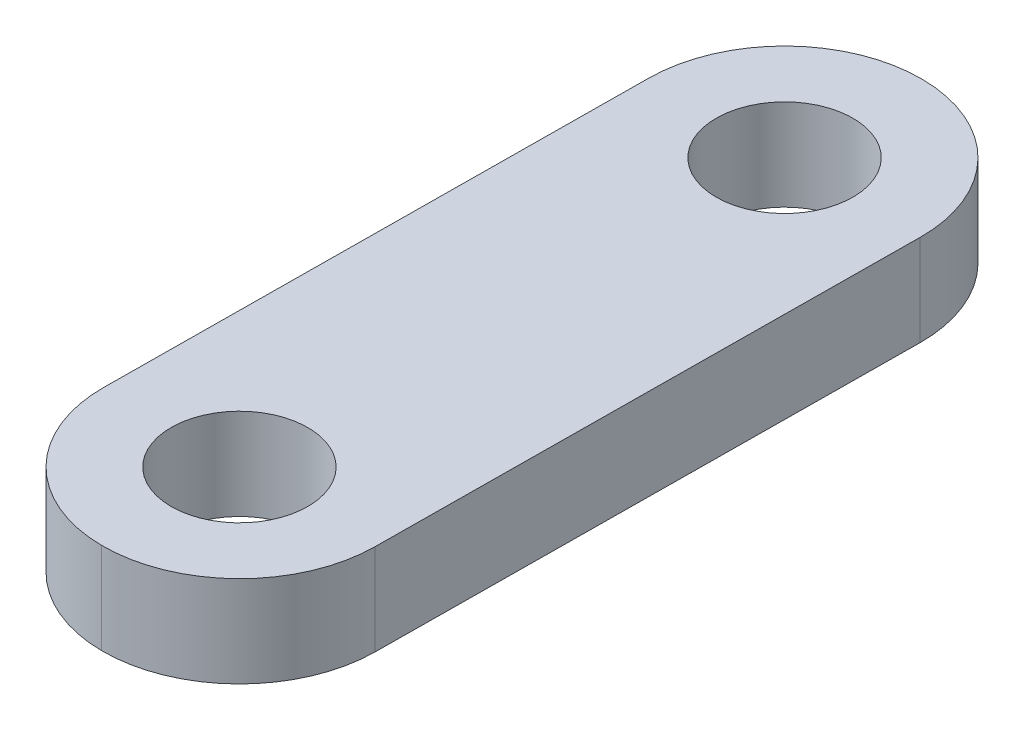
ISO-10303-21;
HEADER;
FILE_DESCRIPTION(('STEP AP214'),'2;1');
FILE_NAME('part.step','',(''),(''),'','','');
FILE_SCHEMA(('AUTOMOTIVE_DESIGN { 1 0 10303 214 1 1 1 1 }'));
ENDSEC;
DATA;
#1=APPLICATION_CONTEXT('core data for automotive mechanical design processes');
#2=APPLICATION_PROTOCOL_DEFINITION('international standard','automotive_design',2000,#1);
#3=PRODUCT_CONTEXT('',#1,'mechanical');
#4=PRODUCT('Part','Part','',(#3));
#5=PRODUCT_RELATED_PRODUCT_CATEGORY('part','',(#4));
#6=PRODUCT_DEFINITION_FORMATION('','',#4);
#7=PRODUCT_DEFINITION_CONTEXT('part definition',#1,'design');
#8=PRODUCT_DEFINITION('design','',#6,#7);
#9=PRODUCT_DEFINITION_SHAPE('','',#8);
#10=(LENGTH_UNIT() NAMED_UNIT(*) SI_UNIT(.MILLI.,.METRE.));
#11=(NAMED_UNIT(*) PLANE_ANGLE_UNIT() SI_UNIT($,.RADIAN.));
#12=(NAMED_UNIT(*) SI_UNIT($,.STERADIAN.) SOLID_ANGLE_UNIT());
#13=UNCERTAINTY_MEASURE_WITH_UNIT(LENGTH_MEASURE(1.E-05),#10,'distance_accuracy_value','');
#14=(GEOMETRIC_REPRESENTATION_CONTEXT(3) GLOBAL_UNCERTAINTY_ASSIGNED_CONTEXT((#13)) GLOBAL_UNIT_ASSIGNED_CONTEXT((#10,
#11,#12)) REPRESENTATION_CONTEXT('',''));
#15=CARTESIAN_POINT('',(0.,0.,0.));
#16=DIRECTION('',(0.,0.,1.));
#17=DIRECTION('',(1.,0.,0.));
#18=AXIS2_PLACEMENT_3D('',#15,#16,#17);
#19=CARTESIAN_POINT('',(0.,6.35,0.));
#20=DIRECTION('',(0.,-1.,0.));
#21=DIRECTION('',(0.,0.,-1.));
#22=AXIS2_PLACEMENT_3D('',#19,#20,#21);
#23=PLANE('',#22);
#24=DIRECTION('',(0.999962709223627,0.,0.00863598067069781));
#25=VECTOR('',#24,1.);
#26=CARTESIAN_POINT('',(149.563089122746,6.35,68.9373095472652));
#27=LINE('',#26,#25);
#28=CARTESIAN_POINT('',(159.087733928101,6.35,69.0195672631536));
#29=VERTEX_POINT('',#28);
#30=CARTESIAN_POINT('',(159.08844431739,6.35,69.0195733982905));
#31=VERTEX_POINT('',#30);
#32=EDGE_CURVE('E170',#29,#31,#27,.T.);
#33=ORIENTED_EDGE('',*,*,#32,.T.);
#34=CARTESIAN_POINT('',(159.170702033279,6.35,59.4949285929355));
#35=DIRECTION('',(0.,-1.,0.));
#36=DIRECTION('',(0.,0.,-1.));
#37=AXIS2_PLACEMENT_3D('',#34,#35,#36);
#38=CIRCLE('',#37,9.525);
#39=CARTESIAN_POINT('',(168.695346838634,6.35,59.5771863088239));
#40=VERTEX_POINT('',#39);
#41=EDGE_CURVE('E147',#31,#40,#38,.F.);
#42=ORIENTED_EDGE('',*,*,#41,.T.);
#43=DIRECTION('',(0.00863598067069853,0.,-0.999962709223627));
#44=VECTOR('',#43,1.);
#45=CARTESIAN_POINT('',(169.102624620199,6.35,12.4183737327467));
#46=LINE('',#45,#44);
#47=CARTESIAN_POINT('',(169.02036690431,6.35,21.9430185381017));
#48=VERTEX_POINT('',#47);
#49=EDGE_CURVE('E118',#40,#48,#46,.T.);
#50=ORIENTED_EDGE('',*,*,#49,.T.);
#51=CARTESIAN_POINT('',(159.495722098955,6.35,21.8607608222133));
#52=DIRECTION('',(0.,-1.,0.));
#53=DIRECTION('',(0.,0.,-1.));
#54=AXIS2_PLACEMENT_3D('',#51,#52,#53);
#55=CIRCLE('',#54,9.525);
#56=CARTESIAN_POINT('',(159.577979814844,6.35,12.3361160168583));
#57=VERTEX_POINT('',#56);
#58=EDGE_CURVE('E142',#48,#57,#55,.F.);
#59=ORIENTED_EDGE('',*,*,#58,.T.);
#60=DIRECTION('',(-0.999962709223627,0.,-0.00863598067069785));
#61=VECTOR('',#60,1.);
#62=CARTESIAN_POINT('',(150.052624620199,6.35,12.2538521658329));
#63=LINE('',#62,#61);
#64=CARTESIAN_POINT('',(159.577269425554,6.35,12.3361098817213));
#65=VERTEX_POINT('',#64);
#66=EDGE_CURVE('E125',#57,#65,#63,.T.);
#67=ORIENTED_EDGE('',*,*,#66,.T.);
#68=CARTESIAN_POINT('',(159.495011709665,6.35,21.8607546870764));
#69=DIRECTION('',(0.,-1.,0.));
#70=DIRECTION('',(0.,0.,-1.));
#71=AXIS2_PLACEMENT_3D('',#68,#69,#70);
#72=CIRCLE('',#71,9.525);
#73=CARTESIAN_POINT('',(149.97036690431,6.35,21.778496971188));
#74=VERTEX_POINT('',#73);
#75=EDGE_CURVE('E54',#65,#74,#72,.F.);
#76=ORIENTED_EDGE('',*,*,#75,.T.);
#77=DIRECTION('',(-0.00863598067069657,0.,0.999962709223627));
#78=VECTOR('',#77,1.);
#79=CARTESIAN_POINT('',(150.052624620199,6.35,12.2538521658329));
#80=LINE('',#79,#78);
#81=CARTESIAN_POINT('',(149.645346838634,6.35,59.4126647419101));
#82=VERTEX_POINT('',#81);
#83=EDGE_CURVE('E128',#74,#82,#80,.T.);
#84=ORIENTED_EDGE('',*,*,#83,.T.);
#85=CARTESIAN_POINT('',(159.169991643989,6.35,59.4949224577985));
#86=DIRECTION('',(0.,-1.,0.));
#87=DIRECTION('',(0.,0.,-1.));
#88=AXIS2_PLACEMENT_3D('',#85,#86,#87);
#89=CIRCLE('',#88,9.525);
#90=EDGE_CURVE('E145',#82,#29,#89,.F.);
#91=ORIENTED_EDGE('',*,*,#90,.T.);
#92=EDGE_LOOP('',(#33,#42,#50,#59,#67,#76,#84,#91));
#93=FACE_BOUND('',#92,.T.);
#94=CARTESIAN_POINT('',(159.49536690431,6.35,21.8607577546449));
#95=DIRECTION('',(0.,1.,0.));
#96=DIRECTION('',(0.,0.,1.));
#97=AXIS2_PLACEMENT_3D('',#94,#95,#96);
#98=CIRCLE('',#97,4.76250000000001);
#99=CARTESIAN_POINT('',(159.49536690431,6.35,26.6232577546449));
#100=VERTEX_POINT('',#99);
#101=EDGE_CURVE('E163',#100,#100,#98,.T.);
#102=ORIENTED_EDGE('',*,*,#101,.F.);
#103=EDGE_LOOP('',(#102));
#104=FACE_BOUND('',#103,.T.);
#105=CARTESIAN_POINT('',(159.170346838634,6.35,59.494925525367));
#106=DIRECTION('',(0.,1.,0.));
#107=DIRECTION('',(0.,0.,1.));
#108=AXIS2_PLACEMENT_3D('',#105,#106,#107);
#109=CIRCLE('',#108,4.76250000000001);
#110=CARTESIAN_POINT('',(159.170346838634,6.35,64.257425525367));
#111=VERTEX_POINT('',#110);
#112=EDGE_CURVE('E175',#111,#111,#109,.T.);
#113=ORIENTED_EDGE('',*,*,#112,.F.);
#114=EDGE_LOOP('',(#113));
#115=FACE_BOUND('',#114,.T.);
#116=ADVANCED_FACE('F32',(#93,#104,#115),#23,.F.);
#117=CARTESIAN_POINT('',(0.,0.,0.));
#118=DIRECTION('',(0.,-1.,0.));
#119=DIRECTION('',(0.,0.,-1.));
#120=AXIS2_PLACEMENT_3D('',#117,#118,#119);
#121=PLANE('',#120);
#122=CARTESIAN_POINT('',(159.49536690431,0.,21.8607577546449));
#123=DIRECTION('',(0.,1.,0.));
#124=DIRECTION('',(0.,0.,1.));
#125=AXIS2_PLACEMENT_3D('',#122,#123,#124);
#126=CIRCLE('',#125,4.76250000000001);
#127=CARTESIAN_POINT('',(159.49536690431,0.,26.6232577546449));
#128=VERTEX_POINT('',#127);
#129=EDGE_CURVE('E166',#128,#128,#126,.T.);
#130=ORIENTED_EDGE('',*,*,#129,.T.);
#131=EDGE_LOOP('',(#130));
#132=FACE_BOUND('',#131,.T.);
#133=DIRECTION('',(0.00863598067069853,0.,-0.999962709223627));
#134=VECTOR('',#133,1.);
#135=CARTESIAN_POINT('',(169.102624620199,0.,12.4183737327467));
#136=LINE('',#135,#134);
#137=CARTESIAN_POINT('',(168.695346838634,0.,59.5771863088239));
#138=VERTEX_POINT('',#137);
#139=CARTESIAN_POINT('',(169.02036690431,0.,21.9430185381017));
#140=VERTEX_POINT('',#139);
#141=EDGE_CURVE('E115',#138,#140,#136,.T.);
#142=ORIENTED_EDGE('',*,*,#141,.F.);
#143=CARTESIAN_POINT('',(159.170702033279,0.,59.4949285929355));
#144=DIRECTION('',(0.,-1.,0.));
#145=DIRECTION('',(0.,0.,-1.));
#146=AXIS2_PLACEMENT_3D('',#143,#144,#145);
#147=CIRCLE('',#146,9.525);
#148=CARTESIAN_POINT('',(159.08844431739,0.,69.0195733982905));
#149=VERTEX_POINT('',#148);
#150=EDGE_CURVE('E98',#138,#149,#147,.T.);
#151=ORIENTED_EDGE('',*,*,#150,.T.);
#152=DIRECTION('',(0.999962709223627,0.,0.00863598067069781));
#153=VECTOR('',#152,1.);
#154=CARTESIAN_POINT('',(149.563089122746,0.,68.9373095472652));
#155=LINE('',#154,#153);
#156=CARTESIAN_POINT('',(159.087733928101,0.,69.0195672631536));
#157=VERTEX_POINT('',#156);
#158=EDGE_CURVE('E126',#157,#149,#155,.T.);
#159=ORIENTED_EDGE('',*,*,#158,.F.);
#160=CARTESIAN_POINT('',(159.169991643989,0.,59.4949224577985));
#161=DIRECTION('',(0.,-1.,0.));
#162=DIRECTION('',(0.,0.,-1.));
#163=AXIS2_PLACEMENT_3D('',#160,#161,#162);
#164=CIRCLE('',#163,9.525);
#165=CARTESIAN_POINT('',(149.645346838634,0.,59.4126647419101));
#166=VERTEX_POINT('',#165);
#167=EDGE_CURVE('E109',#157,#166,#164,.T.);
#168=ORIENTED_EDGE('',*,*,#167,.T.);
#169=DIRECTION('',(-0.00863598067069657,0.,0.999962709223627));
#170=VECTOR('',#169,1.);
#171=CARTESIAN_POINT('',(150.052624620199,0.,12.2538521658329));
#172=LINE('',#171,#170);
#173=CARTESIAN_POINT('',(149.97036690431,0.,21.778496971188));
#174=VERTEX_POINT('',#173);
#175=EDGE_CURVE('E130',#174,#166,#172,.T.);
#176=ORIENTED_EDGE('',*,*,#175,.F.);
#177=CARTESIAN_POINT('',(159.495011709665,0.,21.8607546870764));
#178=DIRECTION('',(0.,-1.,0.));
#179=DIRECTION('',(0.,0.,-1.));
#180=AXIS2_PLACEMENT_3D('',#177,#178,#179);
#181=CIRCLE('',#180,9.525);
#182=CARTESIAN_POINT('',(159.577269425554,0.,12.3361098817213));
#183=VERTEX_POINT('',#182);
#184=EDGE_CURVE('E136',#174,#183,#181,.T.);
#185=ORIENTED_EDGE('',*,*,#184,.T.);
#186=DIRECTION('',(-0.999962709223627,0.,-0.00863598067069785));
#187=VECTOR('',#186,1.);
#188=CARTESIAN_POINT('',(150.052624620199,0.,12.2538521658329));
#189=LINE('',#188,#187);
#190=CARTESIAN_POINT('',(159.577979814844,0.,12.3361160168583));
#191=VERTEX_POINT('',#190);
#192=EDGE_CURVE('E158',#191,#183,#189,.T.);
#193=ORIENTED_EDGE('',*,*,#192,.F.);
#194=CARTESIAN_POINT('',(159.495722098955,0.,21.8607608222133));
#195=DIRECTION('',(0.,-1.,0.));
#196=DIRECTION('',(0.,0.,-1.));
#197=AXIS2_PLACEMENT_3D('',#194,#195,#196);
#198=CIRCLE('',#197,9.525);
#199=EDGE_CURVE('E119',#191,#140,#198,.T.);
#200=ORIENTED_EDGE('',*,*,#199,.T.);
#201=EDGE_LOOP('',(#142,#151,#159,#168,#176,#185,#193,#200));
#202=FACE_BOUND('',#201,.T.);
#203=CARTESIAN_POINT('',(159.170346838634,0.,59.494925525367));
#204=DIRECTION('',(0.,1.,0.));
#205=DIRECTION('',(0.,0.,1.));
#206=AXIS2_PLACEMENT_3D('',#203,#204,#205);
#207=CIRCLE('',#206,4.76250000000001);
#208=CARTESIAN_POINT('',(159.170346838634,0.,64.257425525367));
#209=VERTEX_POINT('',#208);
#210=EDGE_CURVE('E177',#209,#209,#207,.T.);
#211=ORIENTED_EDGE('',*,*,#210,.T.);
#212=EDGE_LOOP('',(#211));
#213=FACE_BOUND('',#212,.T.);
#214=ADVANCED_FACE('F122',(#132,#202,#213),#121,.T.);
#215=CARTESIAN_POINT('',(150.052624620199,6.35,12.2538521658329));
#216=DIRECTION('',(-0.00863598067069785,0.,0.999962709223627));
#217=DIRECTION('',(0.999962709223627,0.,0.00863598067069786));
#218=AXIS2_PLACEMENT_3D('',#215,#216,#217);
#219=PLANE('',#218);
#220=ORIENTED_EDGE('',*,*,#192,.T.);
#221=DIRECTION('',(0.,-1.,0.));
#222=VECTOR('',#221,1.);
#223=CARTESIAN_POINT('',(159.577269425554,6.35,12.3361098817213));
#224=LINE('',#223,#222);
#225=EDGE_CURVE('E11',#183,#65,#224,.F.);
#226=ORIENTED_EDGE('',*,*,#225,.T.);
#227=ORIENTED_EDGE('',*,*,#66,.F.);
#228=DIRECTION('',(0.,-1.,0.));
#229=VECTOR('',#228,1.);
#230=CARTESIAN_POINT('',(159.577979814844,6.35,12.3361160168583));
#231=LINE('',#230,#229);
#232=EDGE_CURVE('E40',#57,#191,#231,.T.);
#233=ORIENTED_EDGE('',*,*,#232,.T.);
#234=EDGE_LOOP('',(#220,#226,#227,#233));
#235=FACE_BOUND('',#234,.T.);
#236=ADVANCED_FACE('F157',(#235),#219,.F.);
#237=CARTESIAN_POINT('',(150.052624620199,6.35,12.2538521658329));
#238=DIRECTION('',(0.999962709223627,0.,0.00863598067069657));
#239=DIRECTION('',(0.00863598067069657,0.,-0.999962709223627));
#240=AXIS2_PLACEMENT_3D('',#237,#238,#239);
#241=PLANE('',#240);
#242=ORIENTED_EDGE('',*,*,#175,.T.);
#243=DIRECTION('',(0.,-1.,0.));
#244=VECTOR('',#243,1.);
#245=CARTESIAN_POINT('',(149.645346838634,6.35,59.4126647419101));
#246=LINE('',#245,#244);
#247=EDGE_CURVE('E47',#166,#82,#246,.F.);
#248=ORIENTED_EDGE('',*,*,#247,.T.);
#249=ORIENTED_EDGE('',*,*,#83,.F.);
#250=DIRECTION('',(0.,-1.,0.));
#251=VECTOR('',#250,1.);
#252=CARTESIAN_POINT('',(149.97036690431,6.35,21.778496971188));
#253=LINE('',#252,#251);
#254=EDGE_CURVE('E149',#74,#174,#253,.T.);
#255=ORIENTED_EDGE('',*,*,#254,.T.);
#256=EDGE_LOOP('',(#242,#248,#249,#255));
#257=FACE_BOUND('',#256,.T.);
#258=ADVANCED_FACE('F203',(#257),#241,.F.);
#259=CARTESIAN_POINT('',(149.563089122746,6.35,68.9373095472652));
#260=DIRECTION('',(0.00863598067069781,0.,-0.999962709223627));
#261=DIRECTION('',(-0.999962709223627,0.,-0.00863598067069781));
#262=AXIS2_PLACEMENT_3D('',#259,#260,#261);
#263=PLANE('',#262);
#264=ORIENTED_EDGE('',*,*,#158,.T.);
#265=DIRECTION('',(0.,-1.,0.));
#266=VECTOR('',#265,1.);
#267=CARTESIAN_POINT('',(159.08844431739,6.35,69.0195733982905));
#268=LINE('',#267,#266);
#269=EDGE_CURVE('E103',#149,#31,#268,.F.);
#270=ORIENTED_EDGE('',*,*,#269,.T.);
#271=ORIENTED_EDGE('',*,*,#32,.F.);
#272=DIRECTION('',(0.,-1.,0.));
#273=VECTOR('',#272,1.);
#274=CARTESIAN_POINT('',(159.087733928101,6.35,69.0195672631536));
#275=LINE('',#274,#273);
#276=EDGE_CURVE('E108',#29,#157,#275,.T.);
#277=ORIENTED_EDGE('',*,*,#276,.T.);
#278=EDGE_LOOP('',(#264,#270,#271,#277));
#279=FACE_BOUND('',#278,.T.);
#280=ADVANCED_FACE('F200',(#279),#263,.F.);
#281=CARTESIAN_POINT('',(169.102624620199,6.35,12.4183737327467));
#282=DIRECTION('',(-0.999962709223627,0.,-0.00863598067069853));
#283=DIRECTION('',(-0.00863598067069853,0.,0.999962709223627));
#284=AXIS2_PLACEMENT_3D('',#281,#282,#283);
#285=PLANE('',#284);
#286=ORIENTED_EDGE('',*,*,#49,.F.);
#287=DIRECTION('',(0.,-1.,0.));
#288=VECTOR('',#287,1.);
#289=CARTESIAN_POINT('',(168.695346838634,6.35,59.5771863088239));
#290=LINE('',#289,#288);
#291=EDGE_CURVE('E102',#40,#138,#290,.T.);
#292=ORIENTED_EDGE('',*,*,#291,.T.);
#293=ORIENTED_EDGE('',*,*,#141,.T.);
#294=DIRECTION('',(0.,-1.,0.));
#295=VECTOR('',#294,1.);
#296=CARTESIAN_POINT('',(169.02036690431,6.35,21.9430185381017));
#297=LINE('',#296,#295);
#298=EDGE_CURVE('E120',#140,#48,#297,.F.);
#299=ORIENTED_EDGE('',*,*,#298,.T.);
#300=EDGE_LOOP('',(#286,#292,#293,#299));
#301=FACE_BOUND('',#300,.T.);
#302=ADVANCED_FACE('F114',(#301),#285,.F.);
#303=CARTESIAN_POINT('',(159.49536690431,6.35,21.8607577546449));
#304=DIRECTION('',(0.,-1.,0.));
#305=DIRECTION('',(0.,0.,-1.));
#306=AXIS2_PLACEMENT_3D('',#303,#304,#305);
#307=CYLINDRICAL_SURFACE('',#306,4.76250000000001);
#308=ORIENTED_EDGE('',*,*,#101,.T.);
#309=EDGE_LOOP('',(#308));
#310=FACE_BOUND('',#309,.T.);
#311=ORIENTED_EDGE('',*,*,#129,.F.);
#312=EDGE_LOOP('',(#311));
#313=FACE_BOUND('',#312,.T.);
#314=ADVANCED_FACE('F195',(#310,#313),#307,.F.);
#315=CARTESIAN_POINT('',(159.170346838634,6.35,59.494925525367));
#316=DIRECTION('',(0.,-1.,0.));
#317=DIRECTION('',(0.,0.,-1.));
#318=AXIS2_PLACEMENT_3D('',#315,#316,#317);
#319=CYLINDRICAL_SURFACE('',#318,4.76250000000001);
#320=ORIENTED_EDGE('',*,*,#112,.T.);
#321=EDGE_LOOP('',(#320));
#322=FACE_BOUND('',#321,.T.);
#323=ORIENTED_EDGE('',*,*,#210,.F.);
#324=EDGE_LOOP('',(#323));
#325=FACE_BOUND('',#324,.T.);
#326=ADVANCED_FACE('F183',(#322,#325),#319,.F.);
#327=CARTESIAN_POINT('',(159.170702033279,6.35,59.4949285929355));
#328=DIRECTION('',(0.,-1.,0.));
#329=DIRECTION('',(0.,0.,-1.));
#330=AXIS2_PLACEMENT_3D('',#327,#328,#329);
#331=CYLINDRICAL_SURFACE('',#330,9.525);
#332=ORIENTED_EDGE('',*,*,#41,.F.);
#333=ORIENTED_EDGE('',*,*,#269,.F.);
#334=ORIENTED_EDGE('',*,*,#150,.F.);
#335=ORIENTED_EDGE('',*,*,#291,.F.);
#336=EDGE_LOOP('',(#332,#333,#334,#335));
#337=FACE_BOUND('',#336,.T.);
#338=ADVANCED_FACE('F101',(#337),#331,.T.);
#339=CARTESIAN_POINT('',(159.169991643989,6.35,59.4949224577985));
#340=DIRECTION('',(0.,-1.,0.));
#341=DIRECTION('',(0.,0.,-1.));
#342=AXIS2_PLACEMENT_3D('',#339,#340,#341);
#343=CYLINDRICAL_SURFACE('',#342,9.525);
#344=ORIENTED_EDGE('',*,*,#90,.F.);
#345=ORIENTED_EDGE('',*,*,#247,.F.);
#346=ORIENTED_EDGE('',*,*,#167,.F.);
#347=ORIENTED_EDGE('',*,*,#276,.F.);
#348=EDGE_LOOP('',(#344,#345,#346,#347));
#349=FACE_BOUND('',#348,.T.);
#350=ADVANCED_FACE('F211',(#349),#343,.T.);
#351=CARTESIAN_POINT('',(159.495011709665,6.35,21.8607546870764));
#352=DIRECTION('',(0.,-1.,0.));
#353=DIRECTION('',(0.,0.,-1.));
#354=AXIS2_PLACEMENT_3D('',#351,#352,#353);
#355=CYLINDRICAL_SURFACE('',#354,9.525);
#356=ORIENTED_EDGE('',*,*,#75,.F.);
#357=ORIENTED_EDGE('',*,*,#225,.F.);
#358=ORIENTED_EDGE('',*,*,#184,.F.);
#359=ORIENTED_EDGE('',*,*,#254,.F.);
#360=EDGE_LOOP('',(#356,#357,#358,#359));
#361=FACE_BOUND('',#360,.T.);
#362=ADVANCED_FACE('F213',(#361),#355,.T.);
#363=CARTESIAN_POINT('',(159.495722098955,6.35,21.8607608222133));
#364=DIRECTION('',(0.,-1.,0.));
#365=DIRECTION('',(0.,0.,-1.));
#366=AXIS2_PLACEMENT_3D('',#363,#364,#365);
#367=CYLINDRICAL_SURFACE('',#366,9.525);
#368=ORIENTED_EDGE('',*,*,#58,.F.);
#369=ORIENTED_EDGE('',*,*,#298,.F.);
#370=ORIENTED_EDGE('',*,*,#199,.F.);
#371=ORIENTED_EDGE('',*,*,#232,.F.);
#372=EDGE_LOOP('',(#368,#369,#370,#371));
#373=FACE_BOUND('',#372,.T.);
#374=ADVANCED_FACE('F34',(#373),#367,.T.);
#375=CLOSED_SHELL('',(#116,#214,#236,#258,#280,#302,#314,#326,#338,#350,#362,#374));
#376=MANIFOLD_SOLID_BREP('B2',#375);
#377=ADVANCED_BREP_SHAPE_REPRESENTATION('',(#18,#376),#14);
#378=SHAPE_DEFINITION_REPRESENTATION(#9,#377);
ENDSEC;
END-ISO-10303-21;
